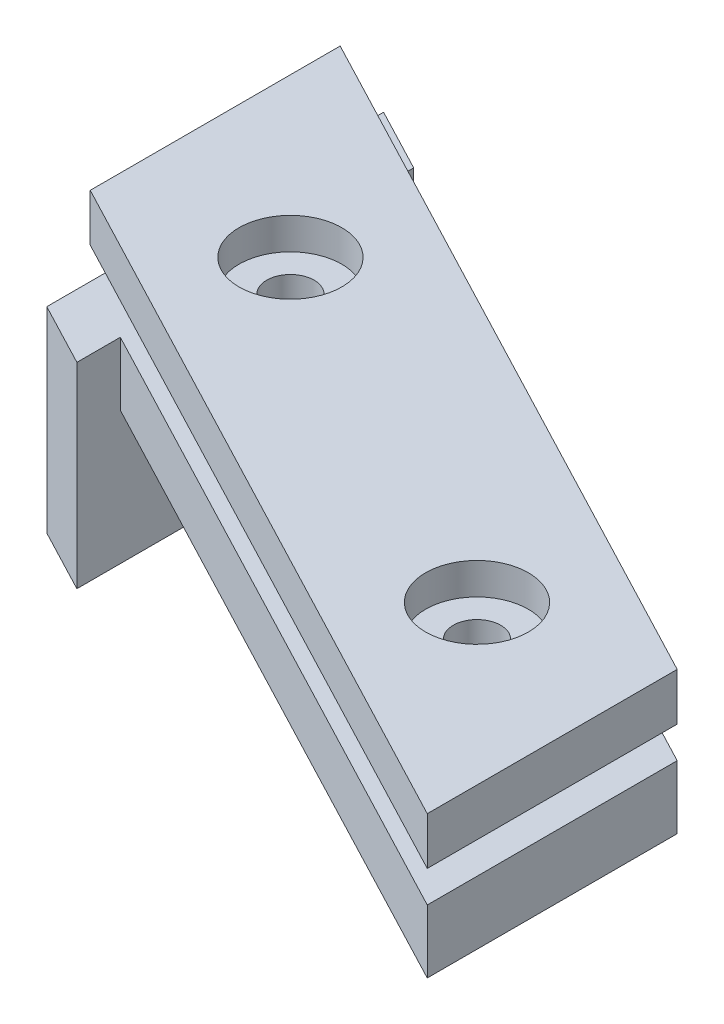
ISO-10303-21;
HEADER;
FILE_DESCRIPTION(('STEP AP214'),'2;1');
FILE_NAME('part.step','',(''),(''),'','','');
FILE_SCHEMA(('AUTOMOTIVE_DESIGN { 1 0 10303 214 1 1 1 1 }'));
ENDSEC;
DATA;
#1=APPLICATION_CONTEXT('core data for automotive mechanical design processes');
#2=APPLICATION_PROTOCOL_DEFINITION('international standard','automotive_design',2000,#1);
#3=PRODUCT_CONTEXT('',#1,'mechanical');
#4=PRODUCT('Part','Part','',(#3));
#5=PRODUCT_RELATED_PRODUCT_CATEGORY('part','',(#4));
#6=PRODUCT_DEFINITION_FORMATION('','',#4);
#7=PRODUCT_DEFINITION_CONTEXT('part definition',#1,'design');
#8=PRODUCT_DEFINITION('design','',#6,#7);
#9=PRODUCT_DEFINITION_SHAPE('','',#8);
#10=(LENGTH_UNIT() NAMED_UNIT(*) SI_UNIT(.MILLI.,.METRE.));
#11=(NAMED_UNIT(*) PLANE_ANGLE_UNIT() SI_UNIT($,.RADIAN.));
#12=(NAMED_UNIT(*) SI_UNIT($,.STERADIAN.) SOLID_ANGLE_UNIT());
#13=UNCERTAINTY_MEASURE_WITH_UNIT(LENGTH_MEASURE(1.E-05),#10,'distance_accuracy_value','');
#14=(GEOMETRIC_REPRESENTATION_CONTEXT(3) GLOBAL_UNCERTAINTY_ASSIGNED_CONTEXT((#13)) GLOBAL_UNIT_ASSIGNED_CONTEXT((#10,
#11,#12)) REPRESENTATION_CONTEXT('',''));
#15=CARTESIAN_POINT('',(0.,0.,0.));
#16=DIRECTION('',(0.,0.,1.));
#17=DIRECTION('',(1.,0.,0.));
#18=AXIS2_PLACEMENT_3D('',#15,#16,#17);
#19=CARTESIAN_POINT('',(0.,-6.,0.));
#20=DIRECTION('',(0.,-1.,0.));
#21=DIRECTION('',(0.,0.,-1.));
#22=AXIS2_PLACEMENT_3D('',#19,#20,#21);
#23=PLANE('',#22);
#24=DIRECTION('',(0.,0.,1.));
#25=VECTOR('',#24,1.);
#26=CARTESIAN_POINT('',(-6.,-6.,0.));
#27=LINE('',#26,#25);
#28=CARTESIAN_POINT('',(-6.,-6.,-11.0487463880735));
#29=VERTEX_POINT('',#28);
#30=CARTESIAN_POINT('',(-5.99999999999998,-6.,4.75821924741853));
#31=VERTEX_POINT('',#30);
#32=EDGE_CURVE('E166',#29,#31,#27,.T.);
#33=ORIENTED_EDGE('',*,*,#32,.F.);
#34=DIRECTION('',(0.88568548340266,0.,0.464285714285714));
#35=VECTOR('',#34,1.);
#36=CARTESIAN_POINT('',(-10.,-6.,-13.1455887682918));
#37=LINE('',#36,#35);
#38=CARTESIAN_POINT('',(34.7991935352745,-6.,10.3386231327998));
#39=VERTEX_POINT('',#38);
#40=EDGE_CURVE('E196',#29,#39,#37,.T.);
#41=ORIENTED_EDGE('',*,*,#40,.T.);
#42=DIRECTION('',(0.,0.,1.));
#43=VECTOR('',#42,1.);
#44=CARTESIAN_POINT('',(34.7991935352745,-6.,10.3386231327998));
#45=LINE('',#44,#43);
#46=CARTESIAN_POINT('',(34.7991935352745,-6.,26.1455887682918));
#47=VERTEX_POINT('',#46);
#48=EDGE_CURVE('E200',#39,#47,#45,.T.);
#49=ORIENTED_EDGE('',*,*,#48,.T.);
#50=DIRECTION('',(-0.88568548340266,0.,-0.464285714285714));
#51=VECTOR('',#50,1.);
#52=CARTESIAN_POINT('',(34.7991935352745,-6.,26.1455887682918));
#53=LINE('',#52,#51);
#54=EDGE_CURVE('E193',#47,#31,#53,.T.);
#55=ORIENTED_EDGE('',*,*,#54,.T.);
#56=EDGE_LOOP('',(#33,#41,#49,#55));
#57=FACE_BOUND('',#56,.T.);
#58=CARTESIAN_POINT('',(0.,-6.,0.));
#59=DIRECTION('',(0.,-1.,0.));
#60=DIRECTION('',(0.,0.,-1.));
#61=AXIS2_PLACEMENT_3D('',#58,#59,#60);
#62=CIRCLE('',#61,1.5);
#63=CARTESIAN_POINT('',(0.,-6.,-1.5));
#64=VERTEX_POINT('',#63);
#65=EDGE_CURVE('E186',#64,#64,#62,.T.);
#66=ORIENTED_EDGE('',*,*,#65,.F.);
#67=EDGE_LOOP('',(#66));
#68=FACE_BOUND('',#67,.T.);
#69=CARTESIAN_POINT('',(24.7991935352745,-6.,13.));
#70=DIRECTION('',(0.,-1.,0.));
#71=DIRECTION('',(0.,0.,-1.));
#72=AXIS2_PLACEMENT_3D('',#69,#70,#71);
#73=CIRCLE('',#72,1.5);
#74=CARTESIAN_POINT('',(24.7991935352745,-6.,11.5));
#75=VERTEX_POINT('',#74);
#76=EDGE_CURVE('E178',#75,#75,#73,.T.);
#77=ORIENTED_EDGE('',*,*,#76,.F.);
#78=EDGE_LOOP('',(#77));
#79=FACE_BOUND('',#78,.T.);
#80=ADVANCED_FACE('F51',(#57,#68,#79),#23,.T.);
#81=CARTESIAN_POINT('',(0.,-2.,0.));
#82=DIRECTION('',(0.,-1.,0.));
#83=DIRECTION('',(0.,0.,-1.));
#84=AXIS2_PLACEMENT_3D('',#81,#82,#83);
#85=PLANE('',#84);
#86=DIRECTION('',(0.88568548340266,0.,0.464285714285714));
#87=VECTOR('',#86,1.);
#88=CARTESIAN_POINT('',(-10.,-2.,-13.1455887682918));
#89=LINE('',#88,#87);
#90=CARTESIAN_POINT('',(-6.,-2.,-11.0487463880735));
#91=VERTEX_POINT('',#90);
#92=CARTESIAN_POINT('',(34.7991935352745,-2.,10.3386231327998));
#93=VERTEX_POINT('',#92);
#94=EDGE_CURVE('E208',#91,#93,#89,.T.);
#95=ORIENTED_EDGE('',*,*,#94,.F.);
#96=DIRECTION('',(0.,0.,-1.));
#97=VECTOR('',#96,1.);
#98=CARTESIAN_POINT('',(-6.,-2.,7.50473642967251));
#99=LINE('',#98,#97);
#100=CARTESIAN_POINT('',(-6.,-2.,-13.7952635703275));
#101=VERTEX_POINT('',#100);
#102=EDGE_CURVE('E150',#91,#101,#99,.T.);
#103=ORIENTED_EDGE('',*,*,#102,.T.);
#104=DIRECTION('',(-0.88568548340266,0.,-0.464285714285715));
#105=VECTOR('',#104,1.);
#106=CARTESIAN_POINT('',(-6.,-2.,-13.7952635703275));
#107=LINE('',#106,#105);
#108=CARTESIAN_POINT('',(-10.,-2.,-15.8921059505458));
#109=VERTEX_POINT('',#108);
#110=EDGE_CURVE('E157',#101,#109,#107,.T.);
#111=ORIENTED_EDGE('',*,*,#110,.T.);
#112=DIRECTION('',(0.,0.,-1.));
#113=VECTOR('',#112,1.);
#114=CARTESIAN_POINT('',(-10.,-2.,2.66137686720019));
#115=LINE('',#114,#113);
#116=CARTESIAN_POINT('',(-10.,-2.,5.40789404945417));
#117=VERTEX_POINT('',#116);
#118=EDGE_CURVE('E122',#117,#109,#115,.T.);
#119=ORIENTED_EDGE('',*,*,#118,.F.);
#120=DIRECTION('',(0.88568548340266,0.,0.464285714285714));
#121=VECTOR('',#120,1.);
#122=CARTESIAN_POINT('',(-10.,-2.,5.40789404945417));
#123=LINE('',#122,#121);
#124=CARTESIAN_POINT('',(-6.,-2.,7.50473642967251));
#125=VERTEX_POINT('',#124);
#126=EDGE_CURVE('E160',#117,#125,#123,.T.);
#127=ORIENTED_EDGE('',*,*,#126,.T.);
#128=CARTESIAN_POINT('',(-5.99999999999998,-2.,4.75821924741853));
#129=VERTEX_POINT('',#128);
#130=EDGE_CURVE('E146',#125,#129,#99,.T.);
#131=ORIENTED_EDGE('',*,*,#130,.T.);
#132=DIRECTION('',(-0.88568548340266,0.,-0.464285714285714));
#133=VECTOR('',#132,1.);
#134=CARTESIAN_POINT('',(34.7991935352745,-2.,26.1455887682918));
#135=LINE('',#134,#133);
#136=CARTESIAN_POINT('',(34.7991935352745,-2.,26.1455887682918));
#137=VERTEX_POINT('',#136);
#138=EDGE_CURVE('E72',#137,#129,#135,.T.);
#139=ORIENTED_EDGE('',*,*,#138,.F.);
#140=DIRECTION('',(0.,0.,1.));
#141=VECTOR('',#140,1.);
#142=CARTESIAN_POINT('',(34.7991935352745,-2.,10.3386231327998));
#143=LINE('',#142,#141);
#144=EDGE_CURVE('E197',#93,#137,#143,.T.);
#145=ORIENTED_EDGE('',*,*,#144,.F.);
#146=EDGE_LOOP('',(#95,#103,#111,#119,#127,#131,#139,#145));
#147=FACE_BOUND('',#146,.T.);
#148=CARTESIAN_POINT('',(0.,-2.,0.));
#149=DIRECTION('',(0.,-1.,0.));
#150=DIRECTION('',(0.,0.,-1.));
#151=AXIS2_PLACEMENT_3D('',#148,#149,#150);
#152=CIRCLE('',#151,1.5);
#153=CARTESIAN_POINT('',(0.,-2.,-1.5));
#154=VERTEX_POINT('',#153);
#155=EDGE_CURVE('E182',#154,#154,#152,.T.);
#156=ORIENTED_EDGE('',*,*,#155,.T.);
#157=EDGE_LOOP('',(#156));
#158=FACE_BOUND('',#157,.T.);
#159=CARTESIAN_POINT('',(24.7991935352745,-2.,13.));
#160=DIRECTION('',(0.,-1.,0.));
#161=DIRECTION('',(0.,0.,-1.));
#162=AXIS2_PLACEMENT_3D('',#159,#160,#161);
#163=CIRCLE('',#162,1.5);
#164=CARTESIAN_POINT('',(24.7991935352745,-2.,11.5));
#165=VERTEX_POINT('',#164);
#166=EDGE_CURVE('E177',#165,#165,#163,.T.);
#167=ORIENTED_EDGE('',*,*,#166,.T.);
#168=EDGE_LOOP('',(#167));
#169=FACE_BOUND('',#168,.T.);
#170=ADVANCED_FACE('F225',(#147,#158,#169),#85,.F.);
#171=CARTESIAN_POINT('',(34.7991935352745,-6.,26.1455887682918));
#172=DIRECTION('',(0.464285714285714,0.,-0.885685483402661));
#173=DIRECTION('',(-0.885685483402661,0.,-0.464285714285714));
#174=AXIS2_PLACEMENT_3D('',#171,#172,#173);
#175=PLANE('',#174);
#176=ORIENTED_EDGE('',*,*,#138,.T.);
#177=DIRECTION('',(0.,-1.,0.));
#178=VECTOR('',#177,1.);
#179=CARTESIAN_POINT('',(-6.,-6.,4.75821924741852));
#180=LINE('',#179,#178);
#181=EDGE_CURVE('E67',#129,#31,#180,.T.);
#182=ORIENTED_EDGE('',*,*,#181,.T.);
#183=ORIENTED_EDGE('',*,*,#54,.F.);
#184=DIRECTION('',(0.,1.,0.));
#185=VECTOR('',#184,1.);
#186=CARTESIAN_POINT('',(34.7991935352745,-6.,26.1455887682918));
#187=LINE('',#186,#185);
#188=EDGE_CURVE('E203',#47,#137,#187,.T.);
#189=ORIENTED_EDGE('',*,*,#188,.T.);
#190=EDGE_LOOP('',(#176,#182,#183,#189));
#191=FACE_BOUND('',#190,.T.);
#192=ADVANCED_FACE('F53',(#191),#175,.F.);
#193=CARTESIAN_POINT('',(-10.,-6.,2.66137686720019));
#194=DIRECTION('',(1.,0.,0.));
#195=DIRECTION('',(0.,0.,-1.));
#196=AXIS2_PLACEMENT_3D('',#193,#194,#195);
#197=PLANE('',#196);
#198=DIRECTION('',(0.,1.,0.));
#199=VECTOR('',#198,1.);
#200=CARTESIAN_POINT('',(-10.,-14.4,5.40789404945417));
#201=LINE('',#200,#199);
#202=CARTESIAN_POINT('',(-10.,-14.4,5.40789404945417));
#203=VERTEX_POINT('',#202);
#204=EDGE_CURVE('E128',#203,#117,#201,.T.);
#205=ORIENTED_EDGE('',*,*,#204,.T.);
#206=ORIENTED_EDGE('',*,*,#118,.T.);
#207=DIRECTION('',(0.,1.,0.));
#208=VECTOR('',#207,1.);
#209=CARTESIAN_POINT('',(-10.,-14.4,-15.8921059505458));
#210=LINE('',#209,#208);
#211=CARTESIAN_POINT('',(-10.,-14.4,-15.8921059505458));
#212=VERTEX_POINT('',#211);
#213=EDGE_CURVE('E117',#212,#109,#210,.T.);
#214=ORIENTED_EDGE('',*,*,#213,.F.);
#215=DIRECTION('',(0.,0.,1.));
#216=VECTOR('',#215,1.);
#217=CARTESIAN_POINT('',(-10.,-14.4,-15.8921059505458));
#218=LINE('',#217,#216);
#219=EDGE_CURVE('E121',#212,#203,#218,.T.);
#220=ORIENTED_EDGE('',*,*,#219,.T.);
#221=EDGE_LOOP('',(#205,#206,#214,#220));
#222=FACE_BOUND('',#221,.T.);
#223=ADVANCED_FACE('F120',(#222),#197,.F.);
#224=CARTESIAN_POINT('',(-10.,-6.,-13.1455887682918));
#225=DIRECTION('',(-0.464285714285714,0.,0.88568548340266));
#226=DIRECTION('',(0.88568548340266,0.,0.464285714285714));
#227=AXIS2_PLACEMENT_3D('',#224,#225,#226);
#228=PLANE('',#227);
#229=ORIENTED_EDGE('',*,*,#40,.F.);
#230=DIRECTION('',(0.,1.,0.));
#231=VECTOR('',#230,1.);
#232=CARTESIAN_POINT('',(-6.,-6.,-11.0487463880735));
#233=LINE('',#232,#231);
#234=EDGE_CURVE('E12',#29,#91,#233,.T.);
#235=ORIENTED_EDGE('',*,*,#234,.T.);
#236=ORIENTED_EDGE('',*,*,#94,.T.);
#237=DIRECTION('',(0.,1.,0.));
#238=VECTOR('',#237,1.);
#239=CARTESIAN_POINT('',(34.7991935352745,-6.,10.3386231327998));
#240=LINE('',#239,#238);
#241=EDGE_CURVE('E60',#39,#93,#240,.T.);
#242=ORIENTED_EDGE('',*,*,#241,.F.);
#243=EDGE_LOOP('',(#229,#235,#236,#242));
#244=FACE_BOUND('',#243,.T.);
#245=ADVANCED_FACE('F235',(#244),#228,.F.);
#246=CARTESIAN_POINT('',(34.7991935352745,-6.,10.3386231327998));
#247=DIRECTION('',(-1.,0.,0.));
#248=DIRECTION('',(0.,0.,1.));
#249=AXIS2_PLACEMENT_3D('',#246,#247,#248);
#250=PLANE('',#249);
#251=ORIENTED_EDGE('',*,*,#144,.T.);
#252=ORIENTED_EDGE('',*,*,#188,.F.);
#253=ORIENTED_EDGE('',*,*,#48,.F.);
#254=ORIENTED_EDGE('',*,*,#241,.T.);
#255=EDGE_LOOP('',(#251,#252,#253,#254));
#256=FACE_BOUND('',#255,.T.);
#257=ADVANCED_FACE('F220',(#256),#250,.F.);
#258=CARTESIAN_POINT('',(0.,-6.,0.));
#259=DIRECTION('',(0.,1.,0.));
#260=DIRECTION('',(0.,0.,1.));
#261=AXIS2_PLACEMENT_3D('',#258,#259,#260);
#262=CYLINDRICAL_SURFACE('',#261,1.5);
#263=ORIENTED_EDGE('',*,*,#65,.T.);
#264=EDGE_LOOP('',(#263));
#265=FACE_BOUND('',#264,.T.);
#266=ORIENTED_EDGE('',*,*,#155,.F.);
#267=EDGE_LOOP('',(#266));
#268=FACE_BOUND('',#267,.T.);
#269=ADVANCED_FACE('F257',(#265,#268),#262,.F.);
#270=CARTESIAN_POINT('',(24.7991935352745,-6.,13.));
#271=DIRECTION('',(0.,1.,0.));
#272=DIRECTION('',(0.,0.,1.));
#273=AXIS2_PLACEMENT_3D('',#270,#271,#272);
#274=CYLINDRICAL_SURFACE('',#273,1.5);
#275=ORIENTED_EDGE('',*,*,#76,.T.);
#276=EDGE_LOOP('',(#275));
#277=FACE_BOUND('',#276,.T.);
#278=ORIENTED_EDGE('',*,*,#166,.F.);
#279=EDGE_LOOP('',(#278));
#280=FACE_BOUND('',#279,.T.);
#281=ADVANCED_FACE('F287',(#277,#280),#274,.F.);
#282=CARTESIAN_POINT('',(-6.,-14.4,7.50473642967251));
#283=DIRECTION('',(1.,0.,0.));
#284=DIRECTION('',(0.,0.,-1.));
#285=AXIS2_PLACEMENT_3D('',#282,#283,#284);
#286=PLANE('',#285);
#287=ORIENTED_EDGE('',*,*,#181,.F.);
#288=ORIENTED_EDGE('',*,*,#130,.F.);
#289=DIRECTION('',(0.,1.,0.));
#290=VECTOR('',#289,1.);
#291=CARTESIAN_POINT('',(-6.,-14.4,7.50473642967251));
#292=LINE('',#291,#290);
#293=CARTESIAN_POINT('',(-6.,-14.4,7.50473642967251));
#294=VERTEX_POINT('',#293);
#295=EDGE_CURVE('E167',#294,#125,#292,.T.);
#296=ORIENTED_EDGE('',*,*,#295,.F.);
#297=DIRECTION('',(0.,0.,-1.));
#298=VECTOR('',#297,1.);
#299=CARTESIAN_POINT('',(-6.,-14.4,7.50473642967251));
#300=LINE('',#299,#298);
#301=CARTESIAN_POINT('',(-6.,-14.4,-13.7952635703275));
#302=VERTEX_POINT('',#301);
#303=EDGE_CURVE('E129',#294,#302,#300,.T.);
#304=ORIENTED_EDGE('',*,*,#303,.T.);
#305=DIRECTION('',(0.,1.,0.));
#306=VECTOR('',#305,1.);
#307=CARTESIAN_POINT('',(-6.,-14.4,-13.7952635703275));
#308=LINE('',#307,#306);
#309=EDGE_CURVE('E144',#302,#101,#308,.T.);
#310=ORIENTED_EDGE('',*,*,#309,.T.);
#311=ORIENTED_EDGE('',*,*,#102,.F.);
#312=ORIENTED_EDGE('',*,*,#234,.F.);
#313=ORIENTED_EDGE('',*,*,#32,.T.);
#314=EDGE_LOOP('',(#287,#288,#296,#304,#310,#311,#312,#313));
#315=FACE_BOUND('',#314,.T.);
#316=ADVANCED_FACE('F230',(#315),#286,.T.);
#317=CARTESIAN_POINT('',(-6.,-14.4,-13.7952635703275));
#318=DIRECTION('',(0.464285714285715,0.,-0.88568548340266));
#319=DIRECTION('',(-0.88568548340266,0.,-0.464285714285715));
#320=AXIS2_PLACEMENT_3D('',#317,#318,#319);
#321=PLANE('',#320);
#322=ORIENTED_EDGE('',*,*,#110,.F.);
#323=ORIENTED_EDGE('',*,*,#309,.F.);
#324=DIRECTION('',(-0.88568548340266,0.,-0.464285714285715));
#325=VECTOR('',#324,1.);
#326=CARTESIAN_POINT('',(-6.,-14.4,-13.7952635703275));
#327=LINE('',#326,#325);
#328=EDGE_CURVE('E136',#302,#212,#327,.T.);
#329=ORIENTED_EDGE('',*,*,#328,.T.);
#330=ORIENTED_EDGE('',*,*,#213,.T.);
#331=EDGE_LOOP('',(#322,#323,#329,#330));
#332=FACE_BOUND('',#331,.T.);
#333=ADVANCED_FACE('F142',(#332),#321,.T.);
#334=CARTESIAN_POINT('',(-10.,-14.4,5.40789404945417));
#335=DIRECTION('',(-0.464285714285714,0.,0.88568548340266));
#336=DIRECTION('',(0.885685483402661,0.,0.464285714285714));
#337=AXIS2_PLACEMENT_3D('',#334,#335,#336);
#338=PLANE('',#337);
#339=ORIENTED_EDGE('',*,*,#126,.F.);
#340=ORIENTED_EDGE('',*,*,#204,.F.);
#341=DIRECTION('',(0.88568548340266,0.,0.464285714285714));
#342=VECTOR('',#341,1.);
#343=CARTESIAN_POINT('',(-10.,-14.4,5.40789404945417));
#344=LINE('',#343,#342);
#345=EDGE_CURVE('E139',#203,#294,#344,.T.);
#346=ORIENTED_EDGE('',*,*,#345,.T.);
#347=ORIENTED_EDGE('',*,*,#295,.T.);
#348=EDGE_LOOP('',(#339,#340,#346,#347));
#349=FACE_BOUND('',#348,.T.);
#350=ADVANCED_FACE('F238',(#349),#338,.T.);
#351=CARTESIAN_POINT('',(0.,-14.4,0.));
#352=DIRECTION('',(0.,1.,0.));
#353=DIRECTION('',(0.,0.,1.));
#354=AXIS2_PLACEMENT_3D('',#351,#352,#353);
#355=PLANE('',#354);
#356=ORIENTED_EDGE('',*,*,#328,.F.);
#357=ORIENTED_EDGE('',*,*,#303,.F.);
#358=ORIENTED_EDGE('',*,*,#345,.F.);
#359=ORIENTED_EDGE('',*,*,#219,.F.);
#360=EDGE_LOOP('',(#356,#357,#358,#359));
#361=FACE_BOUND('',#360,.T.);
#362=ADVANCED_FACE('F134',(#361),#355,.F.);
#363=CLOSED_SHELL('',(#80,#170,#192,#223,#245,#257,#269,#281,#316,#333,#350,#362));
#364=MANIFOLD_SOLID_BREP('B2',#363);
#365=CARTESIAN_POINT('',(24.7991935352745,-2.,13.));
#366=DIRECTION('',(0.,1.,0.));
#367=DIRECTION('',(0.,0.,1.));
#368=AXIS2_PLACEMENT_3D('',#365,#366,#367);
#369=CYLINDRICAL_SURFACE('',#368,1.5);
#370=CARTESIAN_POINT('',(24.7991935352745,-2.,13.));
#371=DIRECTION('',(0.,1.,0.));
#372=DIRECTION('',(0.,0.,1.));
#373=AXIS2_PLACEMENT_3D('',#370,#371,#372);
#374=CIRCLE('',#373,1.5);
#375=CARTESIAN_POINT('',(24.7991935352745,-2.,14.5));
#376=VERTEX_POINT('',#375);
#377=EDGE_CURVE('E434',#376,#376,#374,.T.);
#378=ORIENTED_EDGE('',*,*,#377,.F.);
#379=EDGE_LOOP('',(#378));
#380=FACE_BOUND('',#379,.T.);
#381=CARTESIAN_POINT('',(24.7991935352745,1.,13.));
#382=DIRECTION('',(0.,1.,0.));
#383=DIRECTION('',(0.,0.,1.));
#384=AXIS2_PLACEMENT_3D('',#381,#382,#383);
#385=CIRCLE('',#384,1.5);
#386=CARTESIAN_POINT('',(24.7991935352745,1.,14.5));
#387=VERTEX_POINT('',#386);
#388=EDGE_CURVE('E357',#387,#387,#385,.F.);
#389=ORIENTED_EDGE('',*,*,#388,.F.);
#390=EDGE_LOOP('',(#389));
#391=FACE_BOUND('',#390,.T.);
#392=ADVANCED_FACE('F353',(#380,#391),#369,.F.);
#393=CARTESIAN_POINT('',(0.,-2.,0.));
#394=DIRECTION('',(0.,1.,0.));
#395=DIRECTION('',(0.,0.,1.));
#396=AXIS2_PLACEMENT_3D('',#393,#394,#395);
#397=CYLINDRICAL_SURFACE('',#396,1.5);
#398=CARTESIAN_POINT('',(0.,-2.,0.));
#399=DIRECTION('',(0.,1.,0.));
#400=DIRECTION('',(0.,0.,1.));
#401=AXIS2_PLACEMENT_3D('',#398,#399,#400);
#402=CIRCLE('',#401,1.5);
#403=CARTESIAN_POINT('',(0.,-2.,1.5));
#404=VERTEX_POINT('',#403);
#405=EDGE_CURVE('E449',#404,#404,#402,.T.);
#406=ORIENTED_EDGE('',*,*,#405,.F.);
#407=EDGE_LOOP('',(#406));
#408=FACE_BOUND('',#407,.T.);
#409=CARTESIAN_POINT('',(0.,1.,0.));
#410=DIRECTION('',(0.,1.,0.));
#411=DIRECTION('',(0.,0.,1.));
#412=AXIS2_PLACEMENT_3D('',#409,#410,#411);
#413=CIRCLE('',#412,1.5);
#414=CARTESIAN_POINT('',(0.,1.,1.5));
#415=VERTEX_POINT('',#414);
#416=EDGE_CURVE('E428',#415,#415,#413,.F.);
#417=ORIENTED_EDGE('',*,*,#416,.F.);
#418=EDGE_LOOP('',(#417));
#419=FACE_BOUND('',#418,.T.);
#420=ADVANCED_FACE('F485',(#408,#419),#397,.F.);
#421=CARTESIAN_POINT('',(34.7991935352745,3.,10.3386231327998));
#422=DIRECTION('',(-0.464285714285714,0.,0.88568548340266));
#423=DIRECTION('',(0.88568548340266,0.,0.464285714285714));
#424=AXIS2_PLACEMENT_3D('',#421,#422,#423);
#425=PLANE('',#424);
#426=DIRECTION('',(-0.88568548340266,0.,-0.464285714285714));
#427=VECTOR('',#426,1.);
#428=CARTESIAN_POINT('',(34.7991935352745,0.,10.3386231327998));
#429=LINE('',#428,#427);
#430=CARTESIAN_POINT('',(34.7991935352745,0.,10.3386231327998));
#431=VERTEX_POINT('',#430);
#432=CARTESIAN_POINT('',(-10.,0.,-13.1455887682918));
#433=VERTEX_POINT('',#432);
#434=EDGE_CURVE('E420',#431,#433,#429,.T.);
#435=ORIENTED_EDGE('',*,*,#434,.T.);
#436=DIRECTION('',(0.,-1.,0.));
#437=VECTOR('',#436,1.);
#438=CARTESIAN_POINT('',(-10.,3.,-13.1455887682918));
#439=LINE('',#438,#437);
#440=CARTESIAN_POINT('',(-10.,3.,-13.1455887682918));
#441=VERTEX_POINT('',#440);
#442=EDGE_CURVE('E49',#441,#433,#439,.T.);
#443=ORIENTED_EDGE('',*,*,#442,.F.);
#444=DIRECTION('',(-0.88568548340266,0.,-0.464285714285714));
#445=VECTOR('',#444,1.);
#446=CARTESIAN_POINT('',(34.7991935352745,3.,10.3386231327998));
#447=LINE('',#446,#445);
#448=CARTESIAN_POINT('',(34.7991935352745,3.,10.3386231327998));
#449=VERTEX_POINT('',#448);
#450=EDGE_CURVE('E407',#449,#441,#447,.T.);
#451=ORIENTED_EDGE('',*,*,#450,.F.);
#452=DIRECTION('',(0.,-1.,0.));
#453=VECTOR('',#452,1.);
#454=CARTESIAN_POINT('',(34.7991935352745,3.,10.3386231327998));
#455=LINE('',#454,#453);
#456=EDGE_CURVE('E416',#449,#431,#455,.T.);
#457=ORIENTED_EDGE('',*,*,#456,.T.);
#458=EDGE_LOOP('',(#435,#443,#451,#457));
#459=FACE_BOUND('',#458,.T.);
#460=ADVANCED_FACE('F355',(#459),#425,.F.);
#461=CARTESIAN_POINT('',(-10.,3.,-13.1455887682918));
#462=DIRECTION('',(1.,0.,0.));
#463=DIRECTION('',(0.,0.,-1.));
#464=AXIS2_PLACEMENT_3D('',#461,#462,#463);
#465=PLANE('',#464);
#466=DIRECTION('',(0.,0.,1.));
#467=VECTOR('',#466,1.);
#468=CARTESIAN_POINT('',(-10.,0.,-13.1455887682918));
#469=LINE('',#468,#467);
#470=CARTESIAN_POINT('',(-10.,0.,2.66137686720019));
#471=VERTEX_POINT('',#470);
#472=EDGE_CURVE('E411',#433,#471,#469,.T.);
#473=ORIENTED_EDGE('',*,*,#472,.T.);
#474=DIRECTION('',(0.,-1.,0.));
#475=VECTOR('',#474,1.);
#476=CARTESIAN_POINT('',(-10.,3.,2.66137686720019));
#477=LINE('',#476,#475);
#478=CARTESIAN_POINT('',(-10.,3.,2.66137686720019));
#479=VERTEX_POINT('',#478);
#480=EDGE_CURVE('E363',#479,#471,#477,.T.);
#481=ORIENTED_EDGE('',*,*,#480,.F.);
#482=DIRECTION('',(0.,0.,1.));
#483=VECTOR('',#482,1.);
#484=CARTESIAN_POINT('',(-10.,3.,-13.1455887682918));
#485=LINE('',#484,#483);
#486=EDGE_CURVE('E402',#441,#479,#485,.T.);
#487=ORIENTED_EDGE('',*,*,#486,.F.);
#488=ORIENTED_EDGE('',*,*,#442,.T.);
#489=EDGE_LOOP('',(#473,#481,#487,#488));
#490=FACE_BOUND('',#489,.T.);
#491=ADVANCED_FACE('F410',(#490),#465,.F.);
#492=CARTESIAN_POINT('',(-10.,3.,2.66137686720019));
#493=DIRECTION('',(0.464285714285714,0.,-0.88568548340266));
#494=DIRECTION('',(-0.885685483402661,0.,-0.464285714285714));
#495=AXIS2_PLACEMENT_3D('',#492,#493,#494);
#496=PLANE('',#495);
#497=DIRECTION('',(0.88568548340266,0.,0.464285714285714));
#498=VECTOR('',#497,1.);
#499=CARTESIAN_POINT('',(-10.,0.,2.66137686720019));
#500=LINE('',#499,#498);
#501=CARTESIAN_POINT('',(34.7991935352745,0.,26.1455887682918));
#502=VERTEX_POINT('',#501);
#503=EDGE_CURVE('E389',#471,#502,#500,.T.);
#504=ORIENTED_EDGE('',*,*,#503,.T.);
#505=DIRECTION('',(0.,-1.,0.));
#506=VECTOR('',#505,1.);
#507=CARTESIAN_POINT('',(34.7991935352745,3.,26.1455887682918));
#508=LINE('',#507,#506);
#509=CARTESIAN_POINT('',(34.7991935352745,3.,26.1455887682918));
#510=VERTEX_POINT('',#509);
#511=EDGE_CURVE('E412',#510,#502,#508,.T.);
#512=ORIENTED_EDGE('',*,*,#511,.F.);
#513=DIRECTION('',(0.88568548340266,0.,0.464285714285714));
#514=VECTOR('',#513,1.);
#515=CARTESIAN_POINT('',(-10.,3.,2.66137686720019));
#516=LINE('',#515,#514);
#517=EDGE_CURVE('E405',#479,#510,#516,.T.);
#518=ORIENTED_EDGE('',*,*,#517,.F.);
#519=ORIENTED_EDGE('',*,*,#480,.T.);
#520=EDGE_LOOP('',(#504,#512,#518,#519));
#521=FACE_BOUND('',#520,.T.);
#522=ADVANCED_FACE('F414',(#521),#496,.F.);
#523=CARTESIAN_POINT('',(34.7991935352745,3.,26.1455887682918));
#524=DIRECTION('',(-1.,0.,0.));
#525=DIRECTION('',(0.,0.,1.));
#526=AXIS2_PLACEMENT_3D('',#523,#524,#525);
#527=PLANE('',#526);
#528=DIRECTION('',(0.,0.,-1.));
#529=VECTOR('',#528,1.);
#530=CARTESIAN_POINT('',(34.7991935352745,0.,26.1455887682918));
#531=LINE('',#530,#529);
#532=EDGE_CURVE('E395',#502,#431,#531,.T.);
#533=ORIENTED_EDGE('',*,*,#532,.T.);
#534=ORIENTED_EDGE('',*,*,#456,.F.);
#535=DIRECTION('',(0.,0.,-1.));
#536=VECTOR('',#535,1.);
#537=CARTESIAN_POINT('',(34.7991935352745,3.,26.1455887682918));
#538=LINE('',#537,#536);
#539=EDGE_CURVE('E372',#510,#449,#538,.T.);
#540=ORIENTED_EDGE('',*,*,#539,.F.);
#541=ORIENTED_EDGE('',*,*,#511,.T.);
#542=EDGE_LOOP('',(#533,#534,#540,#541));
#543=FACE_BOUND('',#542,.T.);
#544=ADVANCED_FACE('F588',(#543),#527,.F.);
#545=CARTESIAN_POINT('',(0.,3.,0.));
#546=DIRECTION('',(0.,1.,0.));
#547=DIRECTION('',(0.,0.,1.));
#548=AXIS2_PLACEMENT_3D('',#545,#546,#547);
#549=PLANE('',#548);
#550=CARTESIAN_POINT('',(0.,3.,0.));
#551=DIRECTION('',(0.,1.,0.));
#552=DIRECTION('',(0.,0.,1.));
#553=AXIS2_PLACEMENT_3D('',#550,#551,#552);
#554=CIRCLE('',#553,3.25);
#555=CARTESIAN_POINT('',(0.,3.,3.25));
#556=VERTEX_POINT('',#555);
#557=EDGE_CURVE('E436',#556,#556,#554,.T.);
#558=ORIENTED_EDGE('',*,*,#557,.F.);
#559=EDGE_LOOP('',(#558));
#560=FACE_BOUND('',#559,.T.);
#561=CARTESIAN_POINT('',(24.7991935352745,3.,13.));
#562=DIRECTION('',(0.,1.,0.));
#563=DIRECTION('',(0.,0.,1.));
#564=AXIS2_PLACEMENT_3D('',#561,#562,#563);
#565=CIRCLE('',#564,3.25);
#566=CARTESIAN_POINT('',(24.7991935352745,3.,16.25));
#567=VERTEX_POINT('',#566);
#568=EDGE_CURVE('E446',#567,#567,#565,.T.);
#569=ORIENTED_EDGE('',*,*,#568,.F.);
#570=EDGE_LOOP('',(#569));
#571=FACE_BOUND('',#570,.T.);
#572=ORIENTED_EDGE('',*,*,#450,.T.);
#573=ORIENTED_EDGE('',*,*,#486,.T.);
#574=ORIENTED_EDGE('',*,*,#517,.T.);
#575=ORIENTED_EDGE('',*,*,#539,.T.);
#576=EDGE_LOOP('',(#572,#573,#574,#575));
#577=FACE_BOUND('',#576,.T.);
#578=ADVANCED_FACE('F403',(#560,#571,#577),#549,.T.);
#579=CARTESIAN_POINT('',(0.,0.,0.));
#580=DIRECTION('',(0.,1.,0.));
#581=DIRECTION('',(0.,0.,1.));
#582=AXIS2_PLACEMENT_3D('',#579,#580,#581);
#583=PLANE('',#582);
#584=CARTESIAN_POINT('',(24.7991935352745,0.,13.));
#585=DIRECTION('',(0.,1.,0.));
#586=DIRECTION('',(0.,0.,1.));
#587=AXIS2_PLACEMENT_3D('',#584,#585,#586);
#588=CIRCLE('',#587,6.);
#589=CARTESIAN_POINT('',(24.7991935352745,0.,19.));
#590=VERTEX_POINT('',#589);
#591=EDGE_CURVE('E452',#590,#590,#588,.T.);
#592=ORIENTED_EDGE('',*,*,#591,.T.);
#593=EDGE_LOOP('',(#592));
#594=FACE_BOUND('',#593,.T.);
#595=CARTESIAN_POINT('',(0.,0.,0.));
#596=DIRECTION('',(0.,1.,0.));
#597=DIRECTION('',(0.,0.,1.));
#598=AXIS2_PLACEMENT_3D('',#595,#596,#597);
#599=CIRCLE('',#598,6.);
#600=CARTESIAN_POINT('',(0.,0.,6.));
#601=VERTEX_POINT('',#600);
#602=EDGE_CURVE('E458',#601,#601,#599,.T.);
#603=ORIENTED_EDGE('',*,*,#602,.T.);
#604=EDGE_LOOP('',(#603));
#605=FACE_BOUND('',#604,.T.);
#606=ORIENTED_EDGE('',*,*,#434,.F.);
#607=ORIENTED_EDGE('',*,*,#532,.F.);
#608=ORIENTED_EDGE('',*,*,#503,.F.);
#609=ORIENTED_EDGE('',*,*,#472,.F.);
#610=EDGE_LOOP('',(#606,#607,#608,#609));
#611=FACE_BOUND('',#610,.T.);
#612=ADVANCED_FACE('F466',(#594,#605,#611),#583,.F.);
#613=CARTESIAN_POINT('',(0.,-2.,0.));
#614=DIRECTION('',(0.,1.,0.));
#615=DIRECTION('',(0.,0.,1.));
#616=AXIS2_PLACEMENT_3D('',#613,#614,#615);
#617=CYLINDRICAL_SURFACE('',#616,6.);
#618=CARTESIAN_POINT('',(0.,-2.,0.));
#619=DIRECTION('',(0.,1.,0.));
#620=DIRECTION('',(0.,0.,1.));
#621=AXIS2_PLACEMENT_3D('',#618,#619,#620);
#622=CIRCLE('',#621,6.);
#623=CARTESIAN_POINT('',(0.,-2.,6.));
#624=VERTEX_POINT('',#623);
#625=EDGE_CURVE('E423',#624,#624,#622,.T.);
#626=ORIENTED_EDGE('',*,*,#625,.T.);
#627=EDGE_LOOP('',(#626));
#628=FACE_BOUND('',#627,.T.);
#629=ORIENTED_EDGE('',*,*,#602,.F.);
#630=EDGE_LOOP('',(#629));
#631=FACE_BOUND('',#630,.T.);
#632=ADVANCED_FACE('F469',(#628,#631),#617,.T.);
#633=CARTESIAN_POINT('',(0.,-2.,0.));
#634=DIRECTION('',(0.,1.,0.));
#635=DIRECTION('',(0.,0.,1.));
#636=AXIS2_PLACEMENT_3D('',#633,#634,#635);
#637=PLANE('',#636);
#638=ORIENTED_EDGE('',*,*,#405,.T.);
#639=EDGE_LOOP('',(#638));
#640=FACE_BOUND('',#639,.T.);
#641=ORIENTED_EDGE('',*,*,#625,.F.);
#642=EDGE_LOOP('',(#641));
#643=FACE_BOUND('',#642,.T.);
#644=ADVANCED_FACE('F471',(#640,#643),#637,.F.);
#645=CARTESIAN_POINT('',(24.7991935352745,-2.,13.));
#646=DIRECTION('',(0.,1.,0.));
#647=DIRECTION('',(0.,0.,1.));
#648=AXIS2_PLACEMENT_3D('',#645,#646,#647);
#649=CYLINDRICAL_SURFACE('',#648,6.);
#650=CARTESIAN_POINT('',(24.7991935352745,-2.,13.));
#651=DIRECTION('',(0.,1.,0.));
#652=DIRECTION('',(0.,0.,1.));
#653=AXIS2_PLACEMENT_3D('',#650,#651,#652);
#654=CIRCLE('',#653,6.);
#655=CARTESIAN_POINT('',(24.7991935352745,-2.,19.));
#656=VERTEX_POINT('',#655);
#657=EDGE_CURVE('E455',#656,#656,#654,.T.);
#658=ORIENTED_EDGE('',*,*,#657,.T.);
#659=EDGE_LOOP('',(#658));
#660=FACE_BOUND('',#659,.T.);
#661=ORIENTED_EDGE('',*,*,#591,.F.);
#662=EDGE_LOOP('',(#661));
#663=FACE_BOUND('',#662,.T.);
#664=ADVANCED_FACE('F478',(#660,#663),#649,.T.);
#665=CARTESIAN_POINT('',(24.7991935352745,-2.,13.));
#666=DIRECTION('',(0.,1.,0.));
#667=DIRECTION('',(0.,0.,1.));
#668=AXIS2_PLACEMENT_3D('',#665,#666,#667);
#669=PLANE('',#668);
#670=ORIENTED_EDGE('',*,*,#377,.T.);
#671=EDGE_LOOP('',(#670));
#672=FACE_BOUND('',#671,.T.);
#673=ORIENTED_EDGE('',*,*,#657,.F.);
#674=EDGE_LOOP('',(#673));
#675=FACE_BOUND('',#674,.T.);
#676=ADVANCED_FACE('F497',(#672,#675),#669,.F.);
#677=CARTESIAN_POINT('',(0.,1.,0.));
#678=DIRECTION('',(0.,1.,0.));
#679=DIRECTION('',(0.,0.,1.));
#680=AXIS2_PLACEMENT_3D('',#677,#678,#679);
#681=PLANE('',#680);
#682=CARTESIAN_POINT('',(0.,1.,0.));
#683=DIRECTION('',(0.,1.,0.));
#684=DIRECTION('',(0.,0.,1.));
#685=AXIS2_PLACEMENT_3D('',#682,#683,#684);
#686=CIRCLE('',#685,3.25);
#687=CARTESIAN_POINT('',(0.,1.,3.25));
#688=VERTEX_POINT('',#687);
#689=EDGE_CURVE('E430',#688,#688,#686,.T.);
#690=ORIENTED_EDGE('',*,*,#689,.T.);
#691=EDGE_LOOP('',(#690));
#692=FACE_BOUND('',#691,.T.);
#693=ORIENTED_EDGE('',*,*,#416,.T.);
#694=EDGE_LOOP('',(#693));
#695=FACE_BOUND('',#694,.T.);
#696=ADVANCED_FACE('F500',(#692,#695),#681,.T.);
#697=CARTESIAN_POINT('',(0.,1.,0.));
#698=DIRECTION('',(0.,1.,0.));
#699=DIRECTION('',(0.,0.,1.));
#700=AXIS2_PLACEMENT_3D('',#697,#698,#699);
#701=CYLINDRICAL_SURFACE('',#700,3.25);
#702=ORIENTED_EDGE('',*,*,#689,.F.);
#703=EDGE_LOOP('',(#702));
#704=FACE_BOUND('',#703,.T.);
#705=ORIENTED_EDGE('',*,*,#557,.T.);
#706=EDGE_LOOP('',(#705));
#707=FACE_BOUND('',#706,.T.);
#708=ADVANCED_FACE('F522',(#704,#707),#701,.F.);
#709=CARTESIAN_POINT('',(24.7991935352745,1.,13.));
#710=DIRECTION('',(0.,1.,0.));
#711=DIRECTION('',(0.,0.,1.));
#712=AXIS2_PLACEMENT_3D('',#709,#710,#711);
#713=PLANE('',#712);
#714=CARTESIAN_POINT('',(24.7991935352745,1.,13.));
#715=DIRECTION('',(0.,1.,0.));
#716=DIRECTION('',(0.,0.,1.));
#717=AXIS2_PLACEMENT_3D('',#714,#715,#716);
#718=CIRCLE('',#717,3.25);
#719=CARTESIAN_POINT('',(24.7991935352745,1.,16.25));
#720=VERTEX_POINT('',#719);
#721=EDGE_CURVE('E441',#720,#720,#718,.T.);
#722=ORIENTED_EDGE('',*,*,#721,.T.);
#723=EDGE_LOOP('',(#722));
#724=FACE_BOUND('',#723,.T.);
#725=ORIENTED_EDGE('',*,*,#388,.T.);
#726=EDGE_LOOP('',(#725));
#727=FACE_BOUND('',#726,.T.);
#728=ADVANCED_FACE('F530',(#724,#727),#713,.T.);
#729=CARTESIAN_POINT('',(24.7991935352745,1.,13.));
#730=DIRECTION('',(0.,1.,0.));
#731=DIRECTION('',(0.,0.,1.));
#732=AXIS2_PLACEMENT_3D('',#729,#730,#731);
#733=CYLINDRICAL_SURFACE('',#732,3.25);
#734=ORIENTED_EDGE('',*,*,#721,.F.);
#735=EDGE_LOOP('',(#734));
#736=FACE_BOUND('',#735,.T.);
#737=ORIENTED_EDGE('',*,*,#568,.T.);
#738=EDGE_LOOP('',(#737));
#739=FACE_BOUND('',#738,.T.);
#740=ADVANCED_FACE('F538',(#736,#739),#733,.F.);
#741=CLOSED_SHELL('',(#392,#420,#460,#491,#522,#544,#578,#612,#632,#644,#664,#676,#696,#708,
#728,#740));
#742=MANIFOLD_SOLID_BREP('B6_NOT_SHOWN',#741);
#743=ADVANCED_BREP_SHAPE_REPRESENTATION('',(#18,#364,#742),#14);
#744=SHAPE_DEFINITION_REPRESENTATION(#9,#743);
ENDSEC;
END-ISO-10303-21;
